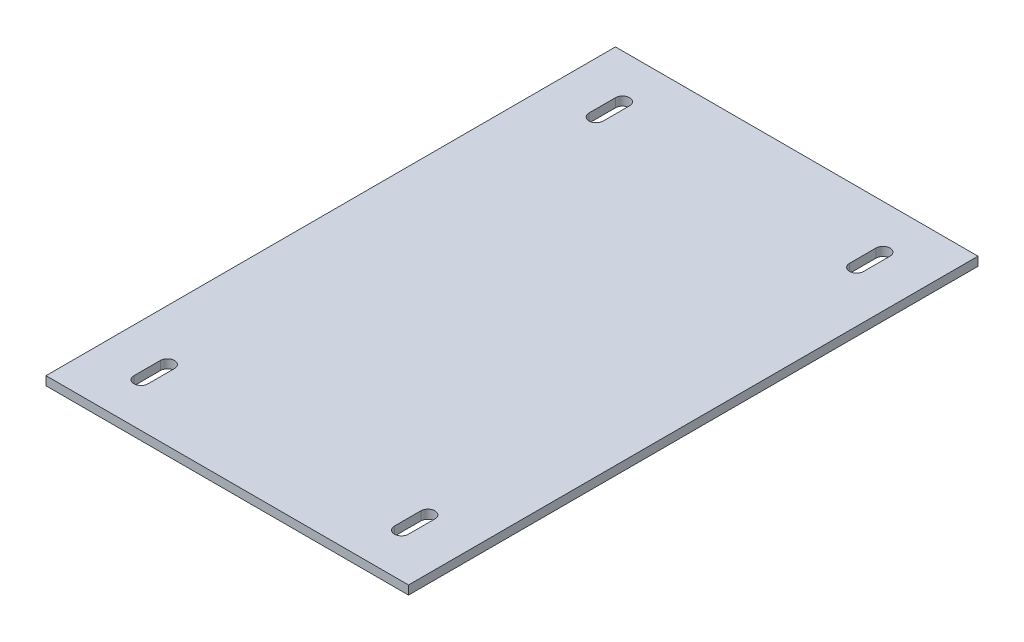
ISO-10303-21;
HEADER;
FILE_DESCRIPTION(('STEP AP214'),'2;1');
FILE_NAME('part.step','',(''),(''),'','','');
FILE_SCHEMA(('AUTOMOTIVE_DESIGN { 1 0 10303 214 1 1 1 1 }'));
ENDSEC;
DATA;
#1=APPLICATION_CONTEXT('core data for automotive mechanical design processes');
#2=APPLICATION_PROTOCOL_DEFINITION('international standard','automotive_design',2000,#1);
#3=PRODUCT_CONTEXT('',#1,'mechanical');
#4=PRODUCT('Part','Part','',(#3));
#5=PRODUCT_RELATED_PRODUCT_CATEGORY('part','',(#4));
#6=PRODUCT_DEFINITION_FORMATION('','',#4);
#7=PRODUCT_DEFINITION_CONTEXT('part definition',#1,'design');
#8=PRODUCT_DEFINITION('design','',#6,#7);
#9=PRODUCT_DEFINITION_SHAPE('','',#8);
#10=(LENGTH_UNIT() NAMED_UNIT(*) SI_UNIT(.MILLI.,.METRE.));
#11=(NAMED_UNIT(*) PLANE_ANGLE_UNIT() SI_UNIT($,.RADIAN.));
#12=(NAMED_UNIT(*) SI_UNIT($,.STERADIAN.) SOLID_ANGLE_UNIT());
#13=UNCERTAINTY_MEASURE_WITH_UNIT(LENGTH_MEASURE(1.E-05),#10,'distance_accuracy_value','');
#14=(GEOMETRIC_REPRESENTATION_CONTEXT(3) GLOBAL_UNCERTAINTY_ASSIGNED_CONTEXT((#13)) GLOBAL_UNIT_ASSIGNED_CONTEXT((#10,
#11,#12)) REPRESENTATION_CONTEXT('',''));
#15=CARTESIAN_POINT('',(0.,0.,0.));
#16=DIRECTION('',(0.,0.,1.));
#17=DIRECTION('',(1.,0.,0.));
#18=AXIS2_PLACEMENT_3D('',#15,#16,#17);
#19=CARTESIAN_POINT('',(0.,5.,0.));
#20=DIRECTION('',(0.,-1.,0.));
#21=DIRECTION('',(0.,0.,-1.));
#22=AXIS2_PLACEMENT_3D('',#19,#20,#21);
#23=PLANE('',#22);
#24=CARTESIAN_POINT('',(177.,5.,-25.));
#25=DIRECTION('',(0.,1.,0.));
#26=DIRECTION('',(0.,0.,1.));
#27=AXIS2_PLACEMENT_3D('',#24,#25,#26);
#28=CIRCLE('',#27,3.99999999999999);
#29=CARTESIAN_POINT('',(173.,5.,-25.));
#30=VERTEX_POINT('',#29);
#31=CARTESIAN_POINT('',(181.,5.,-25.));
#32=VERTEX_POINT('',#31);
#33=EDGE_CURVE('E225',#30,#32,#28,.T.);
#34=ORIENTED_EDGE('',*,*,#33,.F.);
#35=DIRECTION('',(0.,0.,1.));
#36=VECTOR('',#35,1.);
#37=CARTESIAN_POINT('',(173.,5.,-25.));
#38=LINE('',#37,#36);
#39=CARTESIAN_POINT('',(173.,5.,-40.));
#40=VERTEX_POINT('',#39);
#41=EDGE_CURVE('E236',#40,#30,#38,.T.);
#42=ORIENTED_EDGE('',*,*,#41,.F.);
#43=CARTESIAN_POINT('',(177.,5.,-40.));
#44=DIRECTION('',(0.,1.,0.));
#45=DIRECTION('',(0.,0.,1.));
#46=AXIS2_PLACEMENT_3D('',#43,#44,#45);
#47=CIRCLE('',#46,3.99999999999999);
#48=CARTESIAN_POINT('',(181.,5.,-40.));
#49=VERTEX_POINT('',#48);
#50=EDGE_CURVE('E232',#49,#40,#47,.T.);
#51=ORIENTED_EDGE('',*,*,#50,.F.);
#52=DIRECTION('',(0.,0.,-1.));
#53=VECTOR('',#52,1.);
#54=CARTESIAN_POINT('',(181.,5.,-25.));
#55=LINE('',#54,#53);
#56=EDGE_CURVE('E228',#32,#49,#55,.T.);
#57=ORIENTED_EDGE('',*,*,#56,.F.);
#58=EDGE_LOOP('',(#34,#42,#51,#57));
#59=FACE_BOUND('',#58,.T.);
#60=CARTESIAN_POINT('',(29.,5.,-283.61));
#61=DIRECTION('',(0.,1.,0.));
#62=DIRECTION('',(0.,0.,1.));
#63=AXIS2_PLACEMENT_3D('',#60,#61,#62);
#64=CIRCLE('',#63,4.);
#65=CARTESIAN_POINT('',(25.,5.,-283.61));
#66=VERTEX_POINT('',#65);
#67=CARTESIAN_POINT('',(33.,5.,-283.61));
#68=VERTEX_POINT('',#67);
#69=EDGE_CURVE('E311',#66,#68,#64,.T.);
#70=ORIENTED_EDGE('',*,*,#69,.F.);
#71=DIRECTION('',(0.,0.,1.));
#72=VECTOR('',#71,1.);
#73=CARTESIAN_POINT('',(25.,5.,-298.61));
#74=LINE('',#73,#72);
#75=CARTESIAN_POINT('',(25.,5.,-298.61));
#76=VERTEX_POINT('',#75);
#77=EDGE_CURVE('E322',#76,#66,#74,.T.);
#78=ORIENTED_EDGE('',*,*,#77,.F.);
#79=CARTESIAN_POINT('',(29.,5.,-298.61));
#80=DIRECTION('',(0.,1.,0.));
#81=DIRECTION('',(0.,0.,1.));
#82=AXIS2_PLACEMENT_3D('',#79,#80,#81);
#83=CIRCLE('',#82,4.);
#84=CARTESIAN_POINT('',(33.,5.,-298.61));
#85=VERTEX_POINT('',#84);
#86=EDGE_CURVE('E318',#85,#76,#83,.T.);
#87=ORIENTED_EDGE('',*,*,#86,.F.);
#88=DIRECTION('',(0.,0.,-1.));
#89=VECTOR('',#88,1.);
#90=CARTESIAN_POINT('',(33.,5.,-298.61));
#91=LINE('',#90,#89);
#92=EDGE_CURVE('E314',#68,#85,#91,.T.);
#93=ORIENTED_EDGE('',*,*,#92,.F.);
#94=EDGE_LOOP('',(#70,#78,#87,#93));
#95=FACE_BOUND('',#94,.T.);
#96=DIRECTION('',(0.,0.,1.));
#97=VECTOR('',#96,1.);
#98=CARTESIAN_POINT('',(0.,5.,0.));
#99=LINE('',#98,#97);
#100=CARTESIAN_POINT('',(0.,5.,-323.61));
#101=VERTEX_POINT('',#100);
#102=CARTESIAN_POINT('',(0.,5.,0.));
#103=VERTEX_POINT('',#102);
#104=EDGE_CURVE('E354',#101,#103,#99,.T.);
#105=ORIENTED_EDGE('',*,*,#104,.T.);
#106=DIRECTION('',(1.,0.,0.));
#107=VECTOR('',#106,1.);
#108=CARTESIAN_POINT('',(0.,5.,0.));
#109=LINE('',#108,#107);
#110=CARTESIAN_POINT('',(206.,5.,0.));
#111=VERTEX_POINT('',#110);
#112=EDGE_CURVE('E358',#103,#111,#109,.T.);
#113=ORIENTED_EDGE('',*,*,#112,.T.);
#114=DIRECTION('',(0.,0.,-1.));
#115=VECTOR('',#114,1.);
#116=CARTESIAN_POINT('',(206.,5.,0.));
#117=LINE('',#116,#115);
#118=CARTESIAN_POINT('',(206.,5.,-323.61));
#119=VERTEX_POINT('',#118);
#120=EDGE_CURVE('E362',#111,#119,#117,.T.);
#121=ORIENTED_EDGE('',*,*,#120,.T.);
#122=DIRECTION('',(-1.,0.,0.));
#123=VECTOR('',#122,1.);
#124=CARTESIAN_POINT('',(0.,5.,-323.61));
#125=LINE('',#124,#123);
#126=EDGE_CURVE('E365',#119,#101,#125,.T.);
#127=ORIENTED_EDGE('',*,*,#126,.T.);
#128=EDGE_LOOP('',(#105,#113,#121,#127));
#129=FACE_BOUND('',#128,.T.);
#130=CARTESIAN_POINT('',(29.,5.,-40.));
#131=DIRECTION('',(0.,1.,0.));
#132=DIRECTION('',(0.,0.,-1.));
#133=AXIS2_PLACEMENT_3D('',#130,#131,#132);
#134=CIRCLE('',#133,3.99999999999999);
#135=CARTESIAN_POINT('',(33.,5.,-40.));
#136=VERTEX_POINT('',#135);
#137=CARTESIAN_POINT('',(25.,5.,-40.));
#138=VERTEX_POINT('',#137);
#139=EDGE_CURVE('E268',#136,#138,#134,.T.);
#140=ORIENTED_EDGE('',*,*,#139,.F.);
#141=DIRECTION('',(0.,0.,-1.));
#142=VECTOR('',#141,1.);
#143=CARTESIAN_POINT('',(33.,5.,-25.));
#144=LINE('',#143,#142);
#145=CARTESIAN_POINT('',(33.,5.,-25.));
#146=VERTEX_POINT('',#145);
#147=EDGE_CURVE('E279',#146,#136,#144,.T.);
#148=ORIENTED_EDGE('',*,*,#147,.F.);
#149=CARTESIAN_POINT('',(29.,5.,-25.));
#150=DIRECTION('',(0.,1.,0.));
#151=DIRECTION('',(0.,0.,-1.));
#152=AXIS2_PLACEMENT_3D('',#149,#150,#151);
#153=CIRCLE('',#152,3.99999999999999);
#154=CARTESIAN_POINT('',(25.,5.,-25.));
#155=VERTEX_POINT('',#154);
#156=EDGE_CURVE('E275',#155,#146,#153,.T.);
#157=ORIENTED_EDGE('',*,*,#156,.F.);
#158=DIRECTION('',(0.,0.,1.));
#159=VECTOR('',#158,1.);
#160=CARTESIAN_POINT('',(25.,5.,-25.));
#161=LINE('',#160,#159);
#162=EDGE_CURVE('E271',#138,#155,#161,.T.);
#163=ORIENTED_EDGE('',*,*,#162,.F.);
#164=EDGE_LOOP('',(#140,#148,#157,#163));
#165=FACE_BOUND('',#164,.T.);
#166=CARTESIAN_POINT('',(177.,5.,-298.61));
#167=DIRECTION('',(0.,1.,0.));
#168=DIRECTION('',(0.,0.,-1.));
#169=AXIS2_PLACEMENT_3D('',#166,#167,#168);
#170=CIRCLE('',#169,4.);
#171=CARTESIAN_POINT('',(181.,5.,-298.61));
#172=VERTEX_POINT('',#171);
#173=CARTESIAN_POINT('',(173.,5.,-298.61));
#174=VERTEX_POINT('',#173);
#175=EDGE_CURVE('E177',#172,#174,#170,.T.);
#176=ORIENTED_EDGE('',*,*,#175,.F.);
#177=DIRECTION('',(0.,0.,-1.));
#178=VECTOR('',#177,1.);
#179=CARTESIAN_POINT('',(181.,5.,-298.61));
#180=LINE('',#179,#178);
#181=CARTESIAN_POINT('',(181.,5.,-283.61));
#182=VERTEX_POINT('',#181);
#183=EDGE_CURVE('E203',#182,#172,#180,.T.);
#184=ORIENTED_EDGE('',*,*,#183,.F.);
#185=CARTESIAN_POINT('',(177.,5.,-283.61));
#186=DIRECTION('',(0.,1.,0.));
#187=DIRECTION('',(0.,0.,-1.));
#188=AXIS2_PLACEMENT_3D('',#185,#186,#187);
#189=CIRCLE('',#188,4.);
#190=CARTESIAN_POINT('',(173.,5.,-283.61));
#191=VERTEX_POINT('',#190);
#192=EDGE_CURVE('E199',#191,#182,#189,.T.);
#193=ORIENTED_EDGE('',*,*,#192,.F.);
#194=DIRECTION('',(0.,0.,1.));
#195=VECTOR('',#194,1.);
#196=CARTESIAN_POINT('',(173.,5.,-298.61));
#197=LINE('',#196,#195);
#198=EDGE_CURVE('E186',#174,#191,#197,.T.);
#199=ORIENTED_EDGE('',*,*,#198,.F.);
#200=EDGE_LOOP('',(#176,#184,#193,#199));
#201=FACE_BOUND('',#200,.T.);
#202=ADVANCED_FACE('F39',(#59,#95,#129,#165,#201),#23,.F.);
#203=CARTESIAN_POINT('',(0.,0.,0.));
#204=DIRECTION('',(0.,-1.,0.));
#205=DIRECTION('',(0.,0.,-1.));
#206=AXIS2_PLACEMENT_3D('',#203,#204,#205);
#207=PLANE('',#206);
#208=DIRECTION('',(0.,0.,1.));
#209=VECTOR('',#208,1.);
#210=CARTESIAN_POINT('',(0.,0.,0.));
#211=LINE('',#210,#209);
#212=CARTESIAN_POINT('',(0.,0.,-323.61));
#213=VERTEX_POINT('',#212);
#214=CARTESIAN_POINT('',(0.,0.,0.));
#215=VERTEX_POINT('',#214);
#216=EDGE_CURVE('E353',#213,#215,#211,.T.);
#217=ORIENTED_EDGE('',*,*,#216,.F.);
#218=DIRECTION('',(-1.,0.,0.));
#219=VECTOR('',#218,1.);
#220=CARTESIAN_POINT('',(0.,0.,-323.61));
#221=LINE('',#220,#219);
#222=CARTESIAN_POINT('',(206.,0.,-323.61));
#223=VERTEX_POINT('',#222);
#224=EDGE_CURVE('E359',#223,#213,#221,.T.);
#225=ORIENTED_EDGE('',*,*,#224,.F.);
#226=DIRECTION('',(0.,0.,-1.));
#227=VECTOR('',#226,1.);
#228=CARTESIAN_POINT('',(206.,0.,0.));
#229=LINE('',#228,#227);
#230=CARTESIAN_POINT('',(206.,0.,0.));
#231=VERTEX_POINT('',#230);
#232=EDGE_CURVE('E375',#231,#223,#229,.T.);
#233=ORIENTED_EDGE('',*,*,#232,.F.);
#234=DIRECTION('',(1.,0.,0.));
#235=VECTOR('',#234,1.);
#236=CARTESIAN_POINT('',(0.,0.,0.));
#237=LINE('',#236,#235);
#238=EDGE_CURVE('E372',#215,#231,#237,.T.);
#239=ORIENTED_EDGE('',*,*,#238,.F.);
#240=EDGE_LOOP('',(#217,#225,#233,#239));
#241=FACE_BOUND('',#240,.T.);
#242=DIRECTION('',(0.,0.,1.));
#243=VECTOR('',#242,1.);
#244=CARTESIAN_POINT('',(25.,0.,-298.61));
#245=LINE('',#244,#243);
#246=CARTESIAN_POINT('',(25.,0.,-298.61));
#247=VERTEX_POINT('',#246);
#248=CARTESIAN_POINT('',(25.,0.,-283.61));
#249=VERTEX_POINT('',#248);
#250=EDGE_CURVE('E315',#247,#249,#245,.T.);
#251=ORIENTED_EDGE('',*,*,#250,.T.);
#252=CARTESIAN_POINT('',(29.,0.,-283.61));
#253=DIRECTION('',(0.,1.,0.));
#254=DIRECTION('',(0.,0.,1.));
#255=AXIS2_PLACEMENT_3D('',#252,#253,#254);
#256=CIRCLE('',#255,4.);
#257=CARTESIAN_POINT('',(33.,0.,-283.61));
#258=VERTEX_POINT('',#257);
#259=EDGE_CURVE('E310',#249,#258,#256,.T.);
#260=ORIENTED_EDGE('',*,*,#259,.T.);
#261=DIRECTION('',(0.,0.,-1.));
#262=VECTOR('',#261,1.);
#263=CARTESIAN_POINT('',(33.,0.,-298.61));
#264=LINE('',#263,#262);
#265=CARTESIAN_POINT('',(33.,0.,-298.61));
#266=VERTEX_POINT('',#265);
#267=EDGE_CURVE('E329',#258,#266,#264,.T.);
#268=ORIENTED_EDGE('',*,*,#267,.T.);
#269=CARTESIAN_POINT('',(29.,0.,-298.61));
#270=DIRECTION('',(0.,1.,0.));
#271=DIRECTION('',(0.,0.,1.));
#272=AXIS2_PLACEMENT_3D('',#269,#270,#271);
#273=CIRCLE('',#272,4.);
#274=EDGE_CURVE('E333',#266,#247,#273,.T.);
#275=ORIENTED_EDGE('',*,*,#274,.T.);
#276=EDGE_LOOP('',(#251,#260,#268,#275));
#277=FACE_BOUND('',#276,.T.);
#278=DIRECTION('',(0.,0.,-1.));
#279=VECTOR('',#278,1.);
#280=CARTESIAN_POINT('',(33.,0.,-25.));
#281=LINE('',#280,#279);
#282=CARTESIAN_POINT('',(33.,0.,-25.));
#283=VERTEX_POINT('',#282);
#284=CARTESIAN_POINT('',(33.,0.,-40.));
#285=VERTEX_POINT('',#284);
#286=EDGE_CURVE('E272',#283,#285,#281,.T.);
#287=ORIENTED_EDGE('',*,*,#286,.T.);
#288=CARTESIAN_POINT('',(29.,0.,-40.));
#289=DIRECTION('',(0.,1.,0.));
#290=DIRECTION('',(0.,0.,-1.));
#291=AXIS2_PLACEMENT_3D('',#288,#289,#290);
#292=CIRCLE('',#291,3.99999999999999);
#293=CARTESIAN_POINT('',(25.,0.,-40.));
#294=VERTEX_POINT('',#293);
#295=EDGE_CURVE('E267',#285,#294,#292,.T.);
#296=ORIENTED_EDGE('',*,*,#295,.T.);
#297=DIRECTION('',(0.,0.,1.));
#298=VECTOR('',#297,1.);
#299=CARTESIAN_POINT('',(25.,0.,-25.));
#300=LINE('',#299,#298);
#301=CARTESIAN_POINT('',(25.,0.,-25.));
#302=VERTEX_POINT('',#301);
#303=EDGE_CURVE('E286',#294,#302,#300,.T.);
#304=ORIENTED_EDGE('',*,*,#303,.T.);
#305=CARTESIAN_POINT('',(29.,0.,-25.));
#306=DIRECTION('',(0.,1.,0.));
#307=DIRECTION('',(0.,0.,-1.));
#308=AXIS2_PLACEMENT_3D('',#305,#306,#307);
#309=CIRCLE('',#308,3.99999999999999);
#310=EDGE_CURVE('E290',#302,#283,#309,.T.);
#311=ORIENTED_EDGE('',*,*,#310,.T.);
#312=EDGE_LOOP('',(#287,#296,#304,#311));
#313=FACE_BOUND('',#312,.T.);
#314=DIRECTION('',(0.,0.,1.));
#315=VECTOR('',#314,1.);
#316=CARTESIAN_POINT('',(173.,0.,-25.));
#317=LINE('',#316,#315);
#318=CARTESIAN_POINT('',(173.,0.,-40.));
#319=VERTEX_POINT('',#318);
#320=CARTESIAN_POINT('',(173.,0.,-25.));
#321=VERTEX_POINT('',#320);
#322=EDGE_CURVE('E229',#319,#321,#317,.T.);
#323=ORIENTED_EDGE('',*,*,#322,.T.);
#324=CARTESIAN_POINT('',(177.,0.,-25.));
#325=DIRECTION('',(0.,1.,0.));
#326=DIRECTION('',(0.,0.,1.));
#327=AXIS2_PLACEMENT_3D('',#324,#325,#326);
#328=CIRCLE('',#327,3.99999999999999);
#329=CARTESIAN_POINT('',(181.,0.,-25.));
#330=VERTEX_POINT('',#329);
#331=EDGE_CURVE('E195',#321,#330,#328,.T.);
#332=ORIENTED_EDGE('',*,*,#331,.T.);
#333=DIRECTION('',(0.,0.,-1.));
#334=VECTOR('',#333,1.);
#335=CARTESIAN_POINT('',(181.,0.,-25.));
#336=LINE('',#335,#334);
#337=CARTESIAN_POINT('',(181.,0.,-40.));
#338=VERTEX_POINT('',#337);
#339=EDGE_CURVE('E243',#330,#338,#336,.T.);
#340=ORIENTED_EDGE('',*,*,#339,.T.);
#341=CARTESIAN_POINT('',(177.,0.,-40.));
#342=DIRECTION('',(0.,1.,0.));
#343=DIRECTION('',(0.,0.,1.));
#344=AXIS2_PLACEMENT_3D('',#341,#342,#343);
#345=CIRCLE('',#344,3.99999999999999);
#346=EDGE_CURVE('E247',#338,#319,#345,.T.);
#347=ORIENTED_EDGE('',*,*,#346,.T.);
#348=EDGE_LOOP('',(#323,#332,#340,#347));
#349=FACE_BOUND('',#348,.T.);
#350=DIRECTION('',(0.,0.,-1.));
#351=VECTOR('',#350,1.);
#352=CARTESIAN_POINT('',(181.,0.,-298.61));
#353=LINE('',#352,#351);
#354=CARTESIAN_POINT('',(181.,0.,-283.61));
#355=VERTEX_POINT('',#354);
#356=CARTESIAN_POINT('',(181.,0.,-298.61));
#357=VERTEX_POINT('',#356);
#358=EDGE_CURVE('E187',#355,#357,#353,.T.);
#359=ORIENTED_EDGE('',*,*,#358,.T.);
#360=CARTESIAN_POINT('',(177.,0.,-298.61));
#361=DIRECTION('',(0.,1.,0.));
#362=DIRECTION('',(0.,0.,-1.));
#363=AXIS2_PLACEMENT_3D('',#360,#361,#362);
#364=CIRCLE('',#363,4.);
#365=CARTESIAN_POINT('',(173.,0.,-298.61));
#366=VERTEX_POINT('',#365);
#367=EDGE_CURVE('E63',#357,#366,#364,.T.);
#368=ORIENTED_EDGE('',*,*,#367,.T.);
#369=DIRECTION('',(0.,0.,1.));
#370=VECTOR('',#369,1.);
#371=CARTESIAN_POINT('',(173.,0.,-298.61));
#372=LINE('',#371,#370);
#373=CARTESIAN_POINT('',(173.,0.,-283.61));
#374=VERTEX_POINT('',#373);
#375=EDGE_CURVE('E193',#366,#374,#372,.T.);
#376=ORIENTED_EDGE('',*,*,#375,.T.);
#377=CARTESIAN_POINT('',(177.,0.,-283.61));
#378=DIRECTION('',(0.,1.,0.));
#379=DIRECTION('',(0.,0.,-1.));
#380=AXIS2_PLACEMENT_3D('',#377,#378,#379);
#381=CIRCLE('',#380,4.);
#382=EDGE_CURVE('E212',#374,#355,#381,.T.);
#383=ORIENTED_EDGE('',*,*,#382,.T.);
#384=EDGE_LOOP('',(#359,#368,#376,#383));
#385=FACE_BOUND('',#384,.T.);
#386=ADVANCED_FACE('F398',(#241,#277,#313,#349,#385),#207,.T.);
#387=CARTESIAN_POINT('',(0.,5.,0.));
#388=DIRECTION('',(1.,0.,0.));
#389=DIRECTION('',(0.,0.,-1.));
#390=AXIS2_PLACEMENT_3D('',#387,#388,#389);
#391=PLANE('',#390);
#392=ORIENTED_EDGE('',*,*,#216,.T.);
#393=DIRECTION('',(0.,-1.,0.));
#394=VECTOR('',#393,1.);
#395=CARTESIAN_POINT('',(0.,5.,0.));
#396=LINE('',#395,#394);
#397=EDGE_CURVE('E11',#103,#215,#396,.T.);
#398=ORIENTED_EDGE('',*,*,#397,.F.);
#399=ORIENTED_EDGE('',*,*,#104,.F.);
#400=DIRECTION('',(0.,-1.,0.));
#401=VECTOR('',#400,1.);
#402=CARTESIAN_POINT('',(0.,5.,-323.61));
#403=LINE('',#402,#401);
#404=EDGE_CURVE('E368',#101,#213,#403,.T.);
#405=ORIENTED_EDGE('',*,*,#404,.T.);
#406=EDGE_LOOP('',(#392,#398,#399,#405));
#407=FACE_BOUND('',#406,.T.);
#408=ADVANCED_FACE('F41',(#407),#391,.F.);
#409=CARTESIAN_POINT('',(0.,5.,0.));
#410=DIRECTION('',(0.,0.,-1.));
#411=DIRECTION('',(-1.,0.,0.));
#412=AXIS2_PLACEMENT_3D('',#409,#410,#411);
#413=PLANE('',#412);
#414=ORIENTED_EDGE('',*,*,#238,.T.);
#415=DIRECTION('',(0.,-1.,0.));
#416=VECTOR('',#415,1.);
#417=CARTESIAN_POINT('',(206.,5.,0.));
#418=LINE('',#417,#416);
#419=EDGE_CURVE('E48',#111,#231,#418,.T.);
#420=ORIENTED_EDGE('',*,*,#419,.F.);
#421=ORIENTED_EDGE('',*,*,#112,.F.);
#422=ORIENTED_EDGE('',*,*,#397,.T.);
#423=EDGE_LOOP('',(#414,#420,#421,#422));
#424=FACE_BOUND('',#423,.T.);
#425=ADVANCED_FACE('F409',(#424),#413,.F.);
#426=CARTESIAN_POINT('',(206.,5.,0.));
#427=DIRECTION('',(-1.,0.,0.));
#428=DIRECTION('',(0.,0.,1.));
#429=AXIS2_PLACEMENT_3D('',#426,#427,#428);
#430=PLANE('',#429);
#431=ORIENTED_EDGE('',*,*,#232,.T.);
#432=DIRECTION('',(0.,-1.,0.));
#433=VECTOR('',#432,1.);
#434=CARTESIAN_POINT('',(206.,5.,-323.61));
#435=LINE('',#434,#433);
#436=EDGE_CURVE('E383',#119,#223,#435,.T.);
#437=ORIENTED_EDGE('',*,*,#436,.F.);
#438=ORIENTED_EDGE('',*,*,#120,.F.);
#439=ORIENTED_EDGE('',*,*,#419,.T.);
#440=EDGE_LOOP('',(#431,#437,#438,#439));
#441=FACE_BOUND('',#440,.T.);
#442=ADVANCED_FACE('F392',(#441),#430,.F.);
#443=CARTESIAN_POINT('',(0.,5.,-323.61));
#444=DIRECTION('',(0.,0.,1.));
#445=DIRECTION('',(1.,0.,0.));
#446=AXIS2_PLACEMENT_3D('',#443,#444,#445);
#447=PLANE('',#446);
#448=ORIENTED_EDGE('',*,*,#224,.T.);
#449=ORIENTED_EDGE('',*,*,#404,.F.);
#450=ORIENTED_EDGE('',*,*,#126,.F.);
#451=ORIENTED_EDGE('',*,*,#436,.T.);
#452=EDGE_LOOP('',(#448,#449,#450,#451));
#453=FACE_BOUND('',#452,.T.);
#454=ADVANCED_FACE('F402',(#453),#447,.F.);
#455=CARTESIAN_POINT('',(29.,5.,-283.61));
#456=DIRECTION('',(0.,-1.,0.));
#457=DIRECTION('',(0.,0.,-1.));
#458=AXIS2_PLACEMENT_3D('',#455,#456,#457);
#459=CYLINDRICAL_SURFACE('',#458,4.);
#460=ORIENTED_EDGE('',*,*,#259,.F.);
#461=DIRECTION('',(0.,-1.,0.));
#462=VECTOR('',#461,1.);
#463=CARTESIAN_POINT('',(25.,5.,-283.61));
#464=LINE('',#463,#462);
#465=EDGE_CURVE('E325',#66,#249,#464,.T.);
#466=ORIENTED_EDGE('',*,*,#465,.F.);
#467=ORIENTED_EDGE('',*,*,#69,.T.);
#468=DIRECTION('',(0.,-1.,0.));
#469=VECTOR('',#468,1.);
#470=CARTESIAN_POINT('',(33.,5.,-283.61));
#471=LINE('',#470,#469);
#472=EDGE_CURVE('E349',#68,#258,#471,.T.);
#473=ORIENTED_EDGE('',*,*,#472,.T.);
#474=EDGE_LOOP('',(#460,#466,#467,#473));
#475=FACE_BOUND('',#474,.T.);
#476=ADVANCED_FACE('F426',(#475),#459,.F.);
#477=CARTESIAN_POINT('',(33.,5.,-298.61));
#478=DIRECTION('',(-1.,0.,0.));
#479=DIRECTION('',(0.,0.,1.));
#480=AXIS2_PLACEMENT_3D('',#477,#478,#479);
#481=PLANE('',#480);
#482=ORIENTED_EDGE('',*,*,#267,.F.);
#483=ORIENTED_EDGE('',*,*,#472,.F.);
#484=ORIENTED_EDGE('',*,*,#92,.T.);
#485=DIRECTION('',(0.,-1.,0.));
#486=VECTOR('',#485,1.);
#487=CARTESIAN_POINT('',(33.,5.,-298.61));
#488=LINE('',#487,#486);
#489=EDGE_CURVE('E346',#85,#266,#488,.T.);
#490=ORIENTED_EDGE('',*,*,#489,.T.);
#491=EDGE_LOOP('',(#482,#483,#484,#490));
#492=FACE_BOUND('',#491,.T.);
#493=ADVANCED_FACE('F433',(#492),#481,.T.);
#494=CARTESIAN_POINT('',(29.,5.,-298.61));
#495=DIRECTION('',(0.,-1.,0.));
#496=DIRECTION('',(0.,0.,-1.));
#497=AXIS2_PLACEMENT_3D('',#494,#495,#496);
#498=CYLINDRICAL_SURFACE('',#497,4.);
#499=ORIENTED_EDGE('',*,*,#274,.F.);
#500=ORIENTED_EDGE('',*,*,#489,.F.);
#501=ORIENTED_EDGE('',*,*,#86,.T.);
#502=DIRECTION('',(0.,-1.,0.));
#503=VECTOR('',#502,1.);
#504=CARTESIAN_POINT('',(25.,5.,-298.61));
#505=LINE('',#504,#503);
#506=EDGE_CURVE('E343',#76,#247,#505,.T.);
#507=ORIENTED_EDGE('',*,*,#506,.T.);
#508=EDGE_LOOP('',(#499,#500,#501,#507));
#509=FACE_BOUND('',#508,.T.);
#510=ADVANCED_FACE('F438',(#509),#498,.F.);
#511=CARTESIAN_POINT('',(25.,5.,-298.61));
#512=DIRECTION('',(1.,0.,0.));
#513=DIRECTION('',(0.,0.,-1.));
#514=AXIS2_PLACEMENT_3D('',#511,#512,#513);
#515=PLANE('',#514);
#516=ORIENTED_EDGE('',*,*,#250,.F.);
#517=ORIENTED_EDGE('',*,*,#506,.F.);
#518=ORIENTED_EDGE('',*,*,#77,.T.);
#519=ORIENTED_EDGE('',*,*,#465,.T.);
#520=EDGE_LOOP('',(#516,#517,#518,#519));
#521=FACE_BOUND('',#520,.T.);
#522=ADVANCED_FACE('F445',(#521),#515,.T.);
#523=CARTESIAN_POINT('',(29.,5.,-40.));
#524=DIRECTION('',(0.,-1.,0.));
#525=DIRECTION('',(0.,0.,-1.));
#526=AXIS2_PLACEMENT_3D('',#523,#524,#525);
#527=CYLINDRICAL_SURFACE('',#526,3.99999999999999);
#528=ORIENTED_EDGE('',*,*,#295,.F.);
#529=DIRECTION('',(0.,-1.,0.));
#530=VECTOR('',#529,1.);
#531=CARTESIAN_POINT('',(33.,5.,-40.));
#532=LINE('',#531,#530);
#533=EDGE_CURVE('E282',#136,#285,#532,.T.);
#534=ORIENTED_EDGE('',*,*,#533,.F.);
#535=ORIENTED_EDGE('',*,*,#139,.T.);
#536=DIRECTION('',(0.,-1.,0.));
#537=VECTOR('',#536,1.);
#538=CARTESIAN_POINT('',(25.,5.,-40.));
#539=LINE('',#538,#537);
#540=EDGE_CURVE('E306',#138,#294,#539,.T.);
#541=ORIENTED_EDGE('',*,*,#540,.T.);
#542=EDGE_LOOP('',(#528,#534,#535,#541));
#543=FACE_BOUND('',#542,.T.);
#544=ADVANCED_FACE('F458',(#543),#527,.F.);
#545=CARTESIAN_POINT('',(25.,5.,-25.));
#546=DIRECTION('',(1.,0.,0.));
#547=DIRECTION('',(0.,0.,-1.));
#548=AXIS2_PLACEMENT_3D('',#545,#546,#547);
#549=PLANE('',#548);
#550=ORIENTED_EDGE('',*,*,#303,.F.);
#551=ORIENTED_EDGE('',*,*,#540,.F.);
#552=ORIENTED_EDGE('',*,*,#162,.T.);
#553=DIRECTION('',(0.,-1.,0.));
#554=VECTOR('',#553,1.);
#555=CARTESIAN_POINT('',(25.,5.,-25.));
#556=LINE('',#555,#554);
#557=EDGE_CURVE('E303',#155,#302,#556,.T.);
#558=ORIENTED_EDGE('',*,*,#557,.T.);
#559=EDGE_LOOP('',(#550,#551,#552,#558));
#560=FACE_BOUND('',#559,.T.);
#561=ADVANCED_FACE('F463',(#560),#549,.T.);
#562=CARTESIAN_POINT('',(29.,5.,-25.));
#563=DIRECTION('',(0.,-1.,0.));
#564=DIRECTION('',(0.,0.,-1.));
#565=AXIS2_PLACEMENT_3D('',#562,#563,#564);
#566=CYLINDRICAL_SURFACE('',#565,3.99999999999999);
#567=ORIENTED_EDGE('',*,*,#310,.F.);
#568=ORIENTED_EDGE('',*,*,#557,.F.);
#569=ORIENTED_EDGE('',*,*,#156,.T.);
#570=DIRECTION('',(0.,-1.,0.));
#571=VECTOR('',#570,1.);
#572=CARTESIAN_POINT('',(33.,5.,-25.));
#573=LINE('',#572,#571);
#574=EDGE_CURVE('E300',#146,#283,#573,.T.);
#575=ORIENTED_EDGE('',*,*,#574,.T.);
#576=EDGE_LOOP('',(#567,#568,#569,#575));
#577=FACE_BOUND('',#576,.T.);
#578=ADVANCED_FACE('F467',(#577),#566,.F.);
#579=CARTESIAN_POINT('',(33.,5.,-25.));
#580=DIRECTION('',(-1.,0.,0.));
#581=DIRECTION('',(0.,0.,1.));
#582=AXIS2_PLACEMENT_3D('',#579,#580,#581);
#583=PLANE('',#582);
#584=ORIENTED_EDGE('',*,*,#286,.F.);
#585=ORIENTED_EDGE('',*,*,#574,.F.);
#586=ORIENTED_EDGE('',*,*,#147,.T.);
#587=ORIENTED_EDGE('',*,*,#533,.T.);
#588=EDGE_LOOP('',(#584,#585,#586,#587));
#589=FACE_BOUND('',#588,.T.);
#590=ADVANCED_FACE('F471',(#589),#583,.T.);
#591=CARTESIAN_POINT('',(177.,5.,-25.));
#592=DIRECTION('',(0.,-1.,0.));
#593=DIRECTION('',(0.,0.,-1.));
#594=AXIS2_PLACEMENT_3D('',#591,#592,#593);
#595=CYLINDRICAL_SURFACE('',#594,3.99999999999999);
#596=ORIENTED_EDGE('',*,*,#331,.F.);
#597=DIRECTION('',(0.,-1.,0.));
#598=VECTOR('',#597,1.);
#599=CARTESIAN_POINT('',(173.,5.,-25.));
#600=LINE('',#599,#598);
#601=EDGE_CURVE('E239',#30,#321,#600,.T.);
#602=ORIENTED_EDGE('',*,*,#601,.F.);
#603=ORIENTED_EDGE('',*,*,#33,.T.);
#604=DIRECTION('',(0.,-1.,0.));
#605=VECTOR('',#604,1.);
#606=CARTESIAN_POINT('',(181.,5.,-25.));
#607=LINE('',#606,#605);
#608=EDGE_CURVE('E263',#32,#330,#607,.T.);
#609=ORIENTED_EDGE('',*,*,#608,.T.);
#610=EDGE_LOOP('',(#596,#602,#603,#609));
#611=FACE_BOUND('',#610,.T.);
#612=ADVANCED_FACE('F475',(#611),#595,.F.);
#613=CARTESIAN_POINT('',(181.,5.,-25.));
#614=DIRECTION('',(-1.,0.,0.));
#615=DIRECTION('',(0.,0.,1.));
#616=AXIS2_PLACEMENT_3D('',#613,#614,#615);
#617=PLANE('',#616);
#618=ORIENTED_EDGE('',*,*,#339,.F.);
#619=ORIENTED_EDGE('',*,*,#608,.F.);
#620=ORIENTED_EDGE('',*,*,#56,.T.);
#621=DIRECTION('',(0.,-1.,0.));
#622=VECTOR('',#621,1.);
#623=CARTESIAN_POINT('',(181.,5.,-40.));
#624=LINE('',#623,#622);
#625=EDGE_CURVE('E260',#49,#338,#624,.T.);
#626=ORIENTED_EDGE('',*,*,#625,.T.);
#627=EDGE_LOOP('',(#618,#619,#620,#626));
#628=FACE_BOUND('',#627,.T.);
#629=ADVANCED_FACE('F479',(#628),#617,.T.);
#630=CARTESIAN_POINT('',(177.,5.,-40.));
#631=DIRECTION('',(0.,-1.,0.));
#632=DIRECTION('',(0.,0.,-1.));
#633=AXIS2_PLACEMENT_3D('',#630,#631,#632);
#634=CYLINDRICAL_SURFACE('',#633,3.99999999999999);
#635=ORIENTED_EDGE('',*,*,#346,.F.);
#636=ORIENTED_EDGE('',*,*,#625,.F.);
#637=ORIENTED_EDGE('',*,*,#50,.T.);
#638=DIRECTION('',(0.,-1.,0.));
#639=VECTOR('',#638,1.);
#640=CARTESIAN_POINT('',(173.,5.,-40.));
#641=LINE('',#640,#639);
#642=EDGE_CURVE('E257',#40,#319,#641,.T.);
#643=ORIENTED_EDGE('',*,*,#642,.T.);
#644=EDGE_LOOP('',(#635,#636,#637,#643));
#645=FACE_BOUND('',#644,.T.);
#646=ADVANCED_FACE('F483',(#645),#634,.F.);
#647=CARTESIAN_POINT('',(173.,5.,-25.));
#648=DIRECTION('',(1.,0.,0.));
#649=DIRECTION('',(0.,0.,-1.));
#650=AXIS2_PLACEMENT_3D('',#647,#648,#649);
#651=PLANE('',#650);
#652=ORIENTED_EDGE('',*,*,#322,.F.);
#653=ORIENTED_EDGE('',*,*,#642,.F.);
#654=ORIENTED_EDGE('',*,*,#41,.T.);
#655=ORIENTED_EDGE('',*,*,#601,.T.);
#656=EDGE_LOOP('',(#652,#653,#654,#655));
#657=FACE_BOUND('',#656,.T.);
#658=ADVANCED_FACE('F487',(#657),#651,.T.);
#659=CARTESIAN_POINT('',(177.,5.,-298.61));
#660=DIRECTION('',(0.,-1.,0.));
#661=DIRECTION('',(0.,0.,-1.));
#662=AXIS2_PLACEMENT_3D('',#659,#660,#661);
#663=CYLINDRICAL_SURFACE('',#662,4.);
#664=ORIENTED_EDGE('',*,*,#367,.F.);
#665=DIRECTION('',(0.,-1.,0.));
#666=VECTOR('',#665,1.);
#667=CARTESIAN_POINT('',(181.,5.,-298.61));
#668=LINE('',#667,#666);
#669=EDGE_CURVE('E181',#172,#357,#668,.T.);
#670=ORIENTED_EDGE('',*,*,#669,.F.);
#671=ORIENTED_EDGE('',*,*,#175,.T.);
#672=DIRECTION('',(0.,-1.,0.));
#673=VECTOR('',#672,1.);
#674=CARTESIAN_POINT('',(173.,5.,-298.61));
#675=LINE('',#674,#673);
#676=EDGE_CURVE('E180',#174,#366,#675,.T.);
#677=ORIENTED_EDGE('',*,*,#676,.T.);
#678=EDGE_LOOP('',(#664,#670,#671,#677));
#679=FACE_BOUND('',#678,.T.);
#680=ADVANCED_FACE('F179',(#679),#663,.F.);
#681=CARTESIAN_POINT('',(173.,5.,-298.61));
#682=DIRECTION('',(1.,0.,0.));
#683=DIRECTION('',(0.,0.,-1.));
#684=AXIS2_PLACEMENT_3D('',#681,#682,#683);
#685=PLANE('',#684);
#686=ORIENTED_EDGE('',*,*,#375,.F.);
#687=ORIENTED_EDGE('',*,*,#676,.F.);
#688=ORIENTED_EDGE('',*,*,#198,.T.);
#689=DIRECTION('',(0.,-1.,0.));
#690=VECTOR('',#689,1.);
#691=CARTESIAN_POINT('',(173.,5.,-283.61));
#692=LINE('',#691,#690);
#693=EDGE_CURVE('E196',#191,#374,#692,.T.);
#694=ORIENTED_EDGE('',*,*,#693,.T.);
#695=EDGE_LOOP('',(#686,#687,#688,#694));
#696=FACE_BOUND('',#695,.T.);
#697=ADVANCED_FACE('F190',(#696),#685,.T.);
#698=CARTESIAN_POINT('',(177.,5.,-283.61));
#699=DIRECTION('',(0.,-1.,0.));
#700=DIRECTION('',(0.,0.,-1.));
#701=AXIS2_PLACEMENT_3D('',#698,#699,#700);
#702=CYLINDRICAL_SURFACE('',#701,4.);
#703=ORIENTED_EDGE('',*,*,#382,.F.);
#704=ORIENTED_EDGE('',*,*,#693,.F.);
#705=ORIENTED_EDGE('',*,*,#192,.T.);
#706=DIRECTION('',(0.,-1.,0.));
#707=VECTOR('',#706,1.);
#708=CARTESIAN_POINT('',(181.,5.,-283.61));
#709=LINE('',#708,#707);
#710=EDGE_CURVE('E55',#182,#355,#709,.T.);
#711=ORIENTED_EDGE('',*,*,#710,.T.);
#712=EDGE_LOOP('',(#703,#704,#705,#711));
#713=FACE_BOUND('',#712,.T.);
#714=ADVANCED_FACE('F496',(#713),#702,.F.);
#715=CARTESIAN_POINT('',(181.,5.,-298.61));
#716=DIRECTION('',(-1.,0.,0.));
#717=DIRECTION('',(0.,0.,1.));
#718=AXIS2_PLACEMENT_3D('',#715,#716,#717);
#719=PLANE('',#718);
#720=ORIENTED_EDGE('',*,*,#358,.F.);
#721=ORIENTED_EDGE('',*,*,#710,.F.);
#722=ORIENTED_EDGE('',*,*,#183,.T.);
#723=ORIENTED_EDGE('',*,*,#669,.T.);
#724=EDGE_LOOP('',(#720,#721,#722,#723));
#725=FACE_BOUND('',#724,.T.);
#726=ADVANCED_FACE('F499',(#725),#719,.T.);
#727=CLOSED_SHELL('',(#202,#386,#408,#425,#442,#454,#476,#493,#510,#522,#544,#561,#578,#590,
#612,#629,#646,#658,#680,#697,#714,#726));
#728=MANIFOLD_SOLID_BREP('B2',#727);
#729=ADVANCED_BREP_SHAPE_REPRESENTATION('',(#18,#728),#14);
#730=SHAPE_DEFINITION_REPRESENTATION(#9,#729);
ENDSEC;
END-ISO-10303-21;
